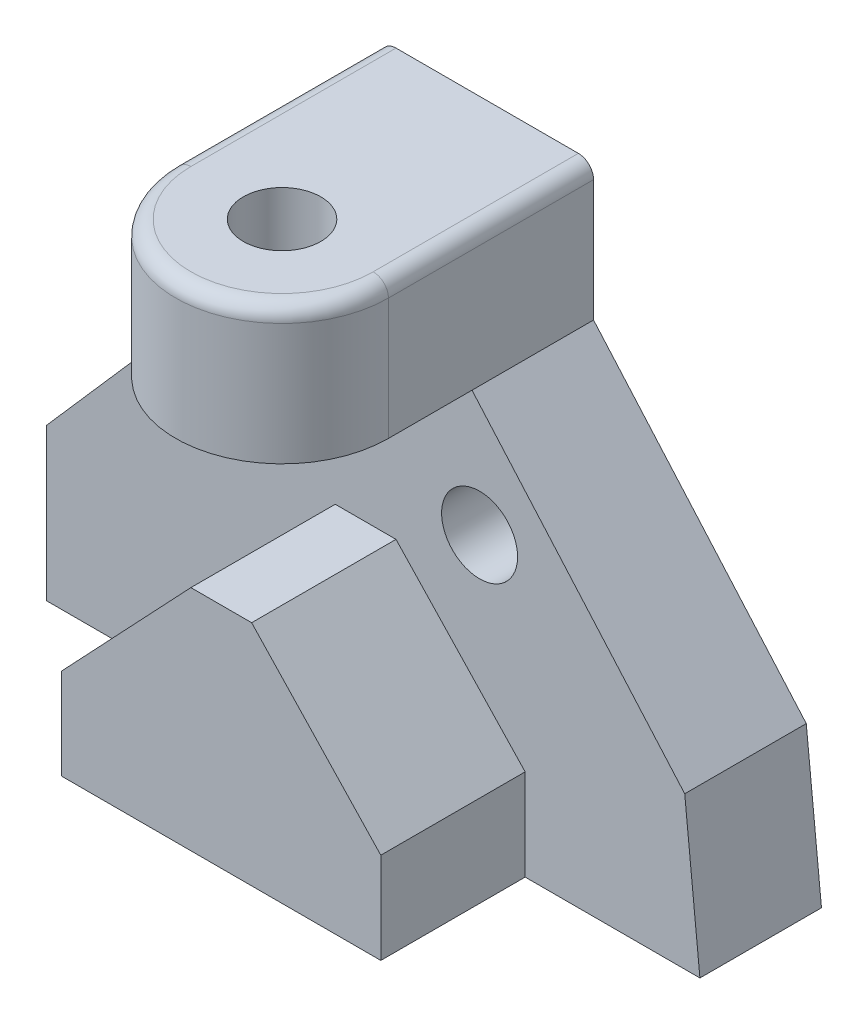
ISO-10303-21;
HEADER;
FILE_DESCRIPTION(('STEP AP214'),'2;1');
FILE_NAME('part.step','',(''),(''),'','','');
FILE_SCHEMA(('AUTOMOTIVE_DESIGN { 1 0 10303 214 1 1 1 1 }'));
ENDSEC;
DATA;
#1=APPLICATION_CONTEXT('core data for automotive mechanical design processes');
#2=APPLICATION_PROTOCOL_DEFINITION('international standard','automotive_design',2000,#1);
#3=PRODUCT_CONTEXT('',#1,'mechanical');
#4=PRODUCT('Part','Part','',(#3));
#5=PRODUCT_RELATED_PRODUCT_CATEGORY('part','',(#4));
#6=PRODUCT_DEFINITION_FORMATION('','',#4);
#7=PRODUCT_DEFINITION_CONTEXT('part definition',#1,'design');
#8=PRODUCT_DEFINITION('design','',#6,#7);
#9=PRODUCT_DEFINITION_SHAPE('','',#8);
#10=(LENGTH_UNIT() NAMED_UNIT(*) SI_UNIT(.MILLI.,.METRE.));
#11=(NAMED_UNIT(*) PLANE_ANGLE_UNIT() SI_UNIT($,.RADIAN.));
#12=(NAMED_UNIT(*) SI_UNIT($,.STERADIAN.) SOLID_ANGLE_UNIT());
#13=UNCERTAINTY_MEASURE_WITH_UNIT(LENGTH_MEASURE(1.E-05),#10,'distance_accuracy_value','');
#14=(GEOMETRIC_REPRESENTATION_CONTEXT(3) GLOBAL_UNCERTAINTY_ASSIGNED_CONTEXT((#13)) GLOBAL_UNIT_ASSIGNED_CONTEXT((#10,
#11,#12)) REPRESENTATION_CONTEXT('',''));
#15=CARTESIAN_POINT('',(0.,0.,0.));
#16=DIRECTION('',(0.,0.,1.));
#17=DIRECTION('',(1.,0.,0.));
#18=AXIS2_PLACEMENT_3D('',#15,#16,#17);
#19=CARTESIAN_POINT('',(0.,0.,16.));
#20=DIRECTION('',(0.,0.,1.));
#21=DIRECTION('',(1.,0.,0.));
#22=AXIS2_PLACEMENT_3D('',#19,#20,#21);
#23=PLANE('',#22);
#24=CARTESIAN_POINT('',(-15.,16.,16.));
#25=DIRECTION('',(0.,0.,1.));
#26=DIRECTION('',(1.,0.,0.));
#27=AXIS2_PLACEMENT_3D('',#24,#25,#26);
#28=CIRCLE('',#27,4.99999999999999);
#29=CARTESIAN_POINT('',(-10.,16.,16.));
#30=VERTEX_POINT('',#29);
#31=EDGE_CURVE('E317',#30,#30,#28,.T.);
#32=ORIENTED_EDGE('',*,*,#31,.F.);
#33=EDGE_LOOP('',(#32));
#34=FACE_BOUND('',#33,.T.);
#35=CARTESIAN_POINT('',(15.,16.,16.));
#36=DIRECTION('',(0.,0.,1.));
#37=DIRECTION('',(1.,0.,0.));
#38=AXIS2_PLACEMENT_3D('',#35,#36,#37);
#39=CIRCLE('',#38,4.99999999999999);
#40=CARTESIAN_POINT('',(20.,16.,16.));
#41=VERTEX_POINT('',#40);
#42=EDGE_CURVE('E309',#41,#41,#39,.T.);
#43=ORIENTED_EDGE('',*,*,#42,.F.);
#44=EDGE_LOOP('',(#43));
#45=FACE_BOUND('',#44,.T.);
#46=DIRECTION('',(0.686623532963717,-0.727013152549817,0.));
#47=VECTOR('',#46,1.);
#48=CARTESIAN_POINT('',(4.,9.99999999999999,16.));
#49=LINE('',#48,#47);
#50=CARTESIAN_POINT('',(4.,9.99999999999999,16.));
#51=VERTEX_POINT('',#50);
#52=CARTESIAN_POINT('',(21.,-8.,16.));
#53=VERTEX_POINT('',#52);
#54=EDGE_CURVE('E198',#51,#53,#49,.T.);
#55=ORIENTED_EDGE('',*,*,#54,.T.);
#56=DIRECTION('',(0.,-1.,0.));
#57=VECTOR('',#56,1.);
#58=CARTESIAN_POINT('',(21.,-8.,16.));
#59=LINE('',#58,#57);
#60=CARTESIAN_POINT('',(21.,-20.,16.));
#61=VERTEX_POINT('',#60);
#62=EDGE_CURVE('E219',#53,#61,#59,.T.);
#63=ORIENTED_EDGE('',*,*,#62,.T.);
#64=DIRECTION('',(1.,0.,0.));
#65=VECTOR('',#64,1.);
#66=CARTESIAN_POINT('',(-42.,-20.,16.));
#67=LINE('',#66,#65);
#68=CARTESIAN_POINT('',(44.,-20.,16.));
#69=VERTEX_POINT('',#68);
#70=EDGE_CURVE('E246',#61,#69,#67,.T.);
#71=ORIENTED_EDGE('',*,*,#70,.T.);
#72=DIRECTION('',(-0.0995037190209993,0.995037190209989,0.));
#73=VECTOR('',#72,1.);
#74=CARTESIAN_POINT('',(42.,0.,16.));
#75=LINE('',#74,#73);
#76=CARTESIAN_POINT('',(42.,0.,16.));
#77=VERTEX_POINT('',#76);
#78=EDGE_CURVE('E249',#69,#77,#75,.T.);
#79=ORIENTED_EDGE('',*,*,#78,.T.);
#80=DIRECTION('',(-0.658504607868518,0.752576694706878,0.));
#81=VECTOR('',#80,1.);
#82=CARTESIAN_POINT('',(14.,32.,16.));
#83=LINE('',#82,#81);
#84=CARTESIAN_POINT('',(14.,32.,16.));
#85=VERTEX_POINT('',#84);
#86=EDGE_CURVE('E251',#77,#85,#83,.T.);
#87=ORIENTED_EDGE('',*,*,#86,.T.);
#88=DIRECTION('',(-1.,0.,0.));
#89=VECTOR('',#88,1.);
#90=CARTESIAN_POINT('',(14.,32.,16.));
#91=LINE('',#90,#89);
#92=CARTESIAN_POINT('',(-14.,32.,16.));
#93=VERTEX_POINT('',#92);
#94=EDGE_CURVE('E254',#85,#93,#91,.T.);
#95=ORIENTED_EDGE('',*,*,#94,.T.);
#96=DIRECTION('',(-0.658504607868518,-0.752576694706878,0.));
#97=VECTOR('',#96,1.);
#98=CARTESIAN_POINT('',(-14.,32.,16.));
#99=LINE('',#98,#97);
#100=CARTESIAN_POINT('',(-42.,0.,16.));
#101=VERTEX_POINT('',#100);
#102=EDGE_CURVE('E240',#93,#101,#99,.T.);
#103=ORIENTED_EDGE('',*,*,#102,.T.);
#104=DIRECTION('',(0.,-1.,0.));
#105=VECTOR('',#104,1.);
#106=CARTESIAN_POINT('',(-42.,0.,16.));
#107=LINE('',#106,#105);
#108=CARTESIAN_POINT('',(-42.,-20.,16.));
#109=VERTEX_POINT('',#108);
#110=EDGE_CURVE('E243',#101,#109,#107,.T.);
#111=ORIENTED_EDGE('',*,*,#110,.T.);
#112=CARTESIAN_POINT('',(-21.,-20.,16.));
#113=VERTEX_POINT('',#112);
#114=EDGE_CURVE('E247',#109,#113,#67,.T.);
#115=ORIENTED_EDGE('',*,*,#114,.T.);
#116=DIRECTION('',(0.,-1.,0.));
#117=VECTOR('',#116,1.);
#118=CARTESIAN_POINT('',(-21.,-8.,16.));
#119=LINE('',#118,#117);
#120=CARTESIAN_POINT('',(-21.,-8.,16.));
#121=VERTEX_POINT('',#120);
#122=EDGE_CURVE('E216',#121,#113,#119,.T.);
#123=ORIENTED_EDGE('',*,*,#122,.F.);
#124=DIRECTION('',(-0.686623532963716,-0.727013152549817,0.));
#125=VECTOR('',#124,1.);
#126=CARTESIAN_POINT('',(-4.,10.,16.));
#127=LINE('',#126,#125);
#128=CARTESIAN_POINT('',(-4.,10.,16.));
#129=VERTEX_POINT('',#128);
#130=EDGE_CURVE('E213',#129,#121,#127,.T.);
#131=ORIENTED_EDGE('',*,*,#130,.F.);
#132=DIRECTION('',(-1.,0.,0.));
#133=VECTOR('',#132,1.);
#134=CARTESIAN_POINT('',(4.,9.99999999999999,16.));
#135=LINE('',#134,#133);
#136=EDGE_CURVE('E165',#51,#129,#135,.T.);
#137=ORIENTED_EDGE('',*,*,#136,.F.);
#138=EDGE_LOOP('',(#55,#63,#71,#79,#87,#95,#103,#111,#115,#123,#131,#137));
#139=FACE_BOUND('',#138,.T.);
#140=ADVANCED_FACE('F40',(#34,#45,#139),#23,.T.);
#141=CARTESIAN_POINT('',(-14.,32.,16.));
#142=DIRECTION('',(0.752576694706878,-0.658504607868518,0.));
#143=DIRECTION('',(0.658504607868518,0.752576694706878,0.));
#144=AXIS2_PLACEMENT_3D('',#141,#142,#143);
#145=PLANE('',#144);
#146=DIRECTION('',(-0.658504607868518,-0.752576694706878,0.));
#147=VECTOR('',#146,1.);
#148=CARTESIAN_POINT('',(-14.,32.,0.));
#149=LINE('',#148,#147);
#150=CARTESIAN_POINT('',(-14.,32.,0.));
#151=VERTEX_POINT('',#150);
#152=CARTESIAN_POINT('',(-42.,0.,0.));
#153=VERTEX_POINT('',#152);
#154=EDGE_CURVE('E239',#151,#153,#149,.T.);
#155=ORIENTED_EDGE('',*,*,#154,.T.);
#156=DIRECTION('',(0.,0.,-1.));
#157=VECTOR('',#156,1.);
#158=CARTESIAN_POINT('',(-42.,0.,16.));
#159=LINE('',#158,#157);
#160=EDGE_CURVE('E279',#101,#153,#159,.T.);
#161=ORIENTED_EDGE('',*,*,#160,.F.);
#162=ORIENTED_EDGE('',*,*,#102,.F.);
#163=DIRECTION('',(0.,0.,-1.));
#164=VECTOR('',#163,1.);
#165=CARTESIAN_POINT('',(-14.,32.,16.));
#166=LINE('',#165,#164);
#167=EDGE_CURVE('E172',#93,#151,#166,.T.);
#168=ORIENTED_EDGE('',*,*,#167,.T.);
#169=EDGE_LOOP('',(#155,#161,#162,#168));
#170=FACE_BOUND('',#169,.T.);
#171=ADVANCED_FACE('F325',(#170),#145,.F.);
#172=CARTESIAN_POINT('',(-42.,0.,16.));
#173=DIRECTION('',(1.,0.,0.));
#174=DIRECTION('',(0.,1.,0.));
#175=AXIS2_PLACEMENT_3D('',#172,#173,#174);
#176=PLANE('',#175);
#177=DIRECTION('',(0.,-1.,0.));
#178=VECTOR('',#177,1.);
#179=CARTESIAN_POINT('',(-42.,0.,0.));
#180=LINE('',#179,#178);
#181=CARTESIAN_POINT('',(-42.,-20.,0.));
#182=VERTEX_POINT('',#181);
#183=EDGE_CURVE('E258',#153,#182,#180,.T.);
#184=ORIENTED_EDGE('',*,*,#183,.T.);
#185=DIRECTION('',(0.,0.,-1.));
#186=VECTOR('',#185,1.);
#187=CARTESIAN_POINT('',(-42.,-20.,16.));
#188=LINE('',#187,#186);
#189=EDGE_CURVE('E276',#109,#182,#188,.T.);
#190=ORIENTED_EDGE('',*,*,#189,.F.);
#191=ORIENTED_EDGE('',*,*,#110,.F.);
#192=ORIENTED_EDGE('',*,*,#160,.T.);
#193=EDGE_LOOP('',(#184,#190,#191,#192));
#194=FACE_BOUND('',#193,.T.);
#195=ADVANCED_FACE('F373',(#194),#176,.F.);
#196=CARTESIAN_POINT('',(-42.,-20.,16.));
#197=DIRECTION('',(0.,1.,0.));
#198=DIRECTION('',(0.,0.,1.));
#199=AXIS2_PLACEMENT_3D('',#196,#197,#198);
#200=PLANE('',#199);
#201=DIRECTION('',(1.,0.,0.));
#202=VECTOR('',#201,1.);
#203=CARTESIAN_POINT('',(-42.,-20.,0.));
#204=LINE('',#203,#202);
#205=CARTESIAN_POINT('',(44.,-20.,0.));
#206=VERTEX_POINT('',#205);
#207=EDGE_CURVE('E260',#182,#206,#204,.T.);
#208=ORIENTED_EDGE('',*,*,#207,.T.);
#209=DIRECTION('',(0.,0.,-1.));
#210=VECTOR('',#209,1.);
#211=CARTESIAN_POINT('',(44.,-20.,16.));
#212=LINE('',#211,#210);
#213=EDGE_CURVE('E273',#69,#206,#212,.T.);
#214=ORIENTED_EDGE('',*,*,#213,.F.);
#215=ORIENTED_EDGE('',*,*,#70,.F.);
#216=DIRECTION('',(0.,0.,-1.));
#217=VECTOR('',#216,1.);
#218=CARTESIAN_POINT('',(21.,-20.,35.));
#219=LINE('',#218,#217);
#220=CARTESIAN_POINT('',(21.,-20.,35.));
#221=VERTEX_POINT('',#220);
#222=EDGE_CURVE('E227',#221,#61,#219,.T.);
#223=ORIENTED_EDGE('',*,*,#222,.F.);
#224=DIRECTION('',(1.,0.,0.));
#225=VECTOR('',#224,1.);
#226=CARTESIAN_POINT('',(-21.,-20.,35.));
#227=LINE('',#226,#225);
#228=CARTESIAN_POINT('',(-21.,-20.,35.));
#229=VERTEX_POINT('',#228);
#230=EDGE_CURVE('E202',#229,#221,#227,.T.);
#231=ORIENTED_EDGE('',*,*,#230,.F.);
#232=DIRECTION('',(0.,0.,-1.));
#233=VECTOR('',#232,1.);
#234=CARTESIAN_POINT('',(-21.,-20.,35.));
#235=LINE('',#234,#233);
#236=EDGE_CURVE('E230',#229,#113,#235,.T.);
#237=ORIENTED_EDGE('',*,*,#236,.T.);
#238=ORIENTED_EDGE('',*,*,#114,.F.);
#239=ORIENTED_EDGE('',*,*,#189,.T.);
#240=EDGE_LOOP('',(#208,#214,#215,#223,#231,#237,#238,#239));
#241=FACE_BOUND('',#240,.T.);
#242=ADVANCED_FACE('F341',(#241),#200,.F.);
#243=CARTESIAN_POINT('',(42.,0.,16.));
#244=DIRECTION('',(-0.995037190209989,-0.0995037190209993,0.));
#245=DIRECTION('',(0.0995037190209993,-0.995037190209989,0.));
#246=AXIS2_PLACEMENT_3D('',#243,#244,#245);
#247=PLANE('',#246);
#248=DIRECTION('',(-0.0995037190209993,0.995037190209989,0.));
#249=VECTOR('',#248,1.);
#250=CARTESIAN_POINT('',(42.,0.,0.));
#251=LINE('',#250,#249);
#252=CARTESIAN_POINT('',(42.,0.,0.));
#253=VERTEX_POINT('',#252);
#254=EDGE_CURVE('E262',#206,#253,#251,.T.);
#255=ORIENTED_EDGE('',*,*,#254,.T.);
#256=DIRECTION('',(0.,0.,-1.));
#257=VECTOR('',#256,1.);
#258=CARTESIAN_POINT('',(42.,0.,16.));
#259=LINE('',#258,#257);
#260=EDGE_CURVE('E270',#77,#253,#259,.T.);
#261=ORIENTED_EDGE('',*,*,#260,.F.);
#262=ORIENTED_EDGE('',*,*,#78,.F.);
#263=ORIENTED_EDGE('',*,*,#213,.T.);
#264=EDGE_LOOP('',(#255,#261,#262,#263));
#265=FACE_BOUND('',#264,.T.);
#266=ADVANCED_FACE('F348',(#265),#247,.F.);
#267=CARTESIAN_POINT('',(14.,32.,16.));
#268=DIRECTION('',(-0.752576694706878,-0.658504607868518,0.));
#269=DIRECTION('',(0.658504607868518,-0.752576694706878,0.));
#270=AXIS2_PLACEMENT_3D('',#267,#268,#269);
#271=PLANE('',#270);
#272=DIRECTION('',(-0.658504607868518,0.752576694706878,0.));
#273=VECTOR('',#272,1.);
#274=CARTESIAN_POINT('',(14.,32.,0.));
#275=LINE('',#274,#273);
#276=CARTESIAN_POINT('',(14.,32.,0.));
#277=VERTEX_POINT('',#276);
#278=EDGE_CURVE('E244',#253,#277,#275,.T.);
#279=ORIENTED_EDGE('',*,*,#278,.T.);
#280=DIRECTION('',(0.,0.,-1.));
#281=VECTOR('',#280,1.);
#282=CARTESIAN_POINT('',(14.,32.,16.));
#283=LINE('',#282,#281);
#284=EDGE_CURVE('E267',#85,#277,#283,.T.);
#285=ORIENTED_EDGE('',*,*,#284,.F.);
#286=ORIENTED_EDGE('',*,*,#86,.F.);
#287=ORIENTED_EDGE('',*,*,#260,.T.);
#288=EDGE_LOOP('',(#279,#285,#286,#287));
#289=FACE_BOUND('',#288,.T.);
#290=ADVANCED_FACE('F352',(#289),#271,.F.);
#291=CARTESIAN_POINT('',(0.,0.,0.));
#292=DIRECTION('',(0.,0.,1.));
#293=DIRECTION('',(1.,0.,0.));
#294=AXIS2_PLACEMENT_3D('',#291,#292,#293);
#295=PLANE('',#294);
#296=CARTESIAN_POINT('',(-15.,16.,0.));
#297=DIRECTION('',(0.,0.,1.));
#298=DIRECTION('',(1.,0.,0.));
#299=AXIS2_PLACEMENT_3D('',#296,#297,#298);
#300=CIRCLE('',#299,5.);
#301=CARTESIAN_POINT('',(-10.,16.,0.));
#302=VERTEX_POINT('',#301);
#303=EDGE_CURVE('E314',#302,#302,#300,.T.);
#304=ORIENTED_EDGE('',*,*,#303,.T.);
#305=EDGE_LOOP('',(#304));
#306=FACE_BOUND('',#305,.T.);
#307=CARTESIAN_POINT('',(15.,16.,0.));
#308=DIRECTION('',(0.,0.,1.));
#309=DIRECTION('',(1.,0.,0.));
#310=AXIS2_PLACEMENT_3D('',#307,#308,#309);
#311=CIRCLE('',#310,5.);
#312=CARTESIAN_POINT('',(20.,16.,0.));
#313=VERTEX_POINT('',#312);
#314=EDGE_CURVE('E305',#313,#313,#311,.T.);
#315=ORIENTED_EDGE('',*,*,#314,.T.);
#316=EDGE_LOOP('',(#315));
#317=FACE_BOUND('',#316,.T.);
#318=DIRECTION('',(1.,0.,0.));
#319=VECTOR('',#318,1.);
#320=CARTESIAN_POINT('',(-14.,50.,0.));
#321=LINE('',#320,#319);
#322=CARTESIAN_POINT('',(-12.,50.,0.));
#323=VERTEX_POINT('',#322);
#324=CARTESIAN_POINT('',(12.,50.,0.));
#325=VERTEX_POINT('',#324);
#326=EDGE_CURVE('E175',#323,#325,#321,.T.);
#327=ORIENTED_EDGE('',*,*,#326,.T.);
#328=CARTESIAN_POINT('',(12.,48.,0.));
#329=DIRECTION('',(0.,0.,1.));
#330=DIRECTION('',(1.,0.,0.));
#331=AXIS2_PLACEMENT_3D('',#328,#329,#330);
#332=CIRCLE('',#331,2.);
#333=CARTESIAN_POINT('',(14.,48.,0.));
#334=VERTEX_POINT('',#333);
#335=EDGE_CURVE('E291',#325,#334,#332,.F.);
#336=ORIENTED_EDGE('',*,*,#335,.T.);
#337=DIRECTION('',(0.,-1.,0.));
#338=VECTOR('',#337,1.);
#339=CARTESIAN_POINT('',(14.,50.,0.));
#340=LINE('',#339,#338);
#341=EDGE_CURVE('E181',#334,#277,#340,.T.);
#342=ORIENTED_EDGE('',*,*,#341,.T.);
#343=ORIENTED_EDGE('',*,*,#278,.F.);
#344=ORIENTED_EDGE('',*,*,#254,.F.);
#345=ORIENTED_EDGE('',*,*,#207,.F.);
#346=ORIENTED_EDGE('',*,*,#183,.F.);
#347=ORIENTED_EDGE('',*,*,#154,.F.);
#348=DIRECTION('',(0.,-1.,0.));
#349=VECTOR('',#348,1.);
#350=CARTESIAN_POINT('',(-14.,50.,0.));
#351=LINE('',#350,#349);
#352=CARTESIAN_POINT('',(-14.,48.,0.));
#353=VERTEX_POINT('',#352);
#354=EDGE_CURVE('E184',#353,#151,#351,.T.);
#355=ORIENTED_EDGE('',*,*,#354,.F.);
#356=CARTESIAN_POINT('',(-12.,48.,0.));
#357=DIRECTION('',(0.,0.,1.));
#358=DIRECTION('',(1.,0.,0.));
#359=AXIS2_PLACEMENT_3D('',#356,#357,#358);
#360=CIRCLE('',#359,2.);
#361=EDGE_CURVE('E289',#353,#323,#360,.F.);
#362=ORIENTED_EDGE('',*,*,#361,.T.);
#363=EDGE_LOOP('',(#327,#336,#342,#343,#344,#345,#346,#347,#355,#362));
#364=FACE_BOUND('',#363,.T.);
#365=ADVANCED_FACE('F364',(#306,#317,#364),#295,.F.);
#366=CARTESIAN_POINT('',(4.,9.99999999999999,35.));
#367=DIRECTION('',(0.,-1.,0.));
#368=DIRECTION('',(1.,0.,0.));
#369=AXIS2_PLACEMENT_3D('',#366,#367,#368);
#370=PLANE('',#369);
#371=ORIENTED_EDGE('',*,*,#136,.T.);
#372=DIRECTION('',(0.,0.,-1.));
#373=VECTOR('',#372,1.);
#374=CARTESIAN_POINT('',(-4.,10.,35.));
#375=LINE('',#374,#373);
#376=CARTESIAN_POINT('',(-4.,10.,35.));
#377=VERTEX_POINT('',#376);
#378=EDGE_CURVE('E236',#377,#129,#375,.T.);
#379=ORIENTED_EDGE('',*,*,#378,.F.);
#380=DIRECTION('',(-1.,0.,0.));
#381=VECTOR('',#380,1.);
#382=CARTESIAN_POINT('',(4.,9.99999999999999,35.));
#383=LINE('',#382,#381);
#384=CARTESIAN_POINT('',(4.,9.99999999999999,35.));
#385=VERTEX_POINT('',#384);
#386=EDGE_CURVE('E194',#385,#377,#383,.T.);
#387=ORIENTED_EDGE('',*,*,#386,.F.);
#388=DIRECTION('',(0.,0.,-1.));
#389=VECTOR('',#388,1.);
#390=CARTESIAN_POINT('',(4.,9.99999999999999,35.));
#391=LINE('',#390,#389);
#392=EDGE_CURVE('E210',#385,#51,#391,.T.);
#393=ORIENTED_EDGE('',*,*,#392,.T.);
#394=EDGE_LOOP('',(#371,#379,#387,#393));
#395=FACE_BOUND('',#394,.T.);
#396=ADVANCED_FACE('F384',(#395),#370,.F.);
#397=CARTESIAN_POINT('',(-4.,10.,35.));
#398=DIRECTION('',(0.727013152549818,-0.686623532963716,0.));
#399=DIRECTION('',(0.686623532963716,0.727013152549818,0.));
#400=AXIS2_PLACEMENT_3D('',#397,#398,#399);
#401=PLANE('',#400);
#402=ORIENTED_EDGE('',*,*,#130,.T.);
#403=DIRECTION('',(0.,0.,-1.));
#404=VECTOR('',#403,1.);
#405=CARTESIAN_POINT('',(-21.,-8.,35.));
#406=LINE('',#405,#404);
#407=CARTESIAN_POINT('',(-21.,-8.,35.));
#408=VERTEX_POINT('',#407);
#409=EDGE_CURVE('E233',#408,#121,#406,.T.);
#410=ORIENTED_EDGE('',*,*,#409,.F.);
#411=DIRECTION('',(-0.686623532963716,-0.727013152549817,0.));
#412=VECTOR('',#411,1.);
#413=CARTESIAN_POINT('',(-4.,10.,35.));
#414=LINE('',#413,#412);
#415=EDGE_CURVE('E197',#377,#408,#414,.T.);
#416=ORIENTED_EDGE('',*,*,#415,.F.);
#417=ORIENTED_EDGE('',*,*,#378,.T.);
#418=EDGE_LOOP('',(#402,#410,#416,#417));
#419=FACE_BOUND('',#418,.T.);
#420=ADVANCED_FACE('F380',(#419),#401,.F.);
#421=CARTESIAN_POINT('',(-21.,-8.,35.));
#422=DIRECTION('',(1.,0.,0.));
#423=DIRECTION('',(0.,0.,-1.));
#424=AXIS2_PLACEMENT_3D('',#421,#422,#423);
#425=PLANE('',#424);
#426=ORIENTED_EDGE('',*,*,#122,.T.);
#427=ORIENTED_EDGE('',*,*,#236,.F.);
#428=DIRECTION('',(0.,-1.,0.));
#429=VECTOR('',#428,1.);
#430=CARTESIAN_POINT('',(-21.,-8.,35.));
#431=LINE('',#430,#429);
#432=EDGE_CURVE('E200',#408,#229,#431,.T.);
#433=ORIENTED_EDGE('',*,*,#432,.F.);
#434=ORIENTED_EDGE('',*,*,#409,.T.);
#435=EDGE_LOOP('',(#426,#427,#433,#434));
#436=FACE_BOUND('',#435,.T.);
#437=ADVANCED_FACE('F377',(#436),#425,.F.);
#438=CARTESIAN_POINT('',(21.,-8.,35.));
#439=DIRECTION('',(1.,0.,0.));
#440=DIRECTION('',(0.,0.,-1.));
#441=AXIS2_PLACEMENT_3D('',#438,#439,#440);
#442=PLANE('',#441);
#443=ORIENTED_EDGE('',*,*,#62,.F.);
#444=DIRECTION('',(0.,0.,-1.));
#445=VECTOR('',#444,1.);
#446=CARTESIAN_POINT('',(21.,-8.,35.));
#447=LINE('',#446,#445);
#448=CARTESIAN_POINT('',(21.,-8.,35.));
#449=VERTEX_POINT('',#448);
#450=EDGE_CURVE('E224',#449,#53,#447,.T.);
#451=ORIENTED_EDGE('',*,*,#450,.F.);
#452=DIRECTION('',(0.,-1.,0.));
#453=VECTOR('',#452,1.);
#454=CARTESIAN_POINT('',(21.,-8.,35.));
#455=LINE('',#454,#453);
#456=EDGE_CURVE('E204',#449,#221,#455,.T.);
#457=ORIENTED_EDGE('',*,*,#456,.T.);
#458=ORIENTED_EDGE('',*,*,#222,.T.);
#459=EDGE_LOOP('',(#443,#451,#457,#458));
#460=FACE_BOUND('',#459,.T.);
#461=ADVANCED_FACE('F337',(#460),#442,.T.);
#462=CARTESIAN_POINT('',(4.,9.99999999999999,35.));
#463=DIRECTION('',(0.727013152549817,0.686623532963717,0.));
#464=DIRECTION('',(-0.686623532963717,0.727013152549817,0.));
#465=AXIS2_PLACEMENT_3D('',#462,#463,#464);
#466=PLANE('',#465);
#467=ORIENTED_EDGE('',*,*,#54,.F.);
#468=ORIENTED_EDGE('',*,*,#392,.F.);
#469=DIRECTION('',(0.686623532963717,-0.727013152549817,0.));
#470=VECTOR('',#469,1.);
#471=CARTESIAN_POINT('',(4.,9.99999999999999,35.));
#472=LINE('',#471,#470);
#473=EDGE_CURVE('E207',#385,#449,#472,.T.);
#474=ORIENTED_EDGE('',*,*,#473,.T.);
#475=ORIENTED_EDGE('',*,*,#450,.T.);
#476=EDGE_LOOP('',(#467,#468,#474,#475));
#477=FACE_BOUND('',#476,.T.);
#478=ADVANCED_FACE('F333',(#477),#466,.T.);
#479=CARTESIAN_POINT('',(0.,0.,35.));
#480=DIRECTION('',(0.,0.,1.));
#481=DIRECTION('',(1.,0.,0.));
#482=AXIS2_PLACEMENT_3D('',#479,#480,#481);
#483=PLANE('',#482);
#484=ORIENTED_EDGE('',*,*,#386,.T.);
#485=ORIENTED_EDGE('',*,*,#415,.T.);
#486=ORIENTED_EDGE('',*,*,#432,.T.);
#487=ORIENTED_EDGE('',*,*,#230,.T.);
#488=ORIENTED_EDGE('',*,*,#456,.F.);
#489=ORIENTED_EDGE('',*,*,#473,.F.);
#490=EDGE_LOOP('',(#484,#485,#486,#487,#488,#489));
#491=FACE_BOUND('',#490,.T.);
#492=ADVANCED_FACE('F386',(#491),#483,.T.);
#493=CARTESIAN_POINT('',(0.,50.,27.));
#494=DIRECTION('',(0.,-1.,0.));
#495=DIRECTION('',(0.,0.,-1.));
#496=AXIS2_PLACEMENT_3D('',#493,#494,#495);
#497=CYLINDRICAL_SURFACE('',#496,14.);
#498=DIRECTION('',(0.,-1.,0.));
#499=VECTOR('',#498,1.);
#500=CARTESIAN_POINT('',(14.,50.,27.));
#501=LINE('',#500,#499);
#502=CARTESIAN_POINT('',(14.,48.,27.));
#503=VERTEX_POINT('',#502);
#504=CARTESIAN_POINT('',(14.,32.,27.));
#505=VERTEX_POINT('',#504);
#506=EDGE_CURVE('E166',#503,#505,#501,.T.);
#507=ORIENTED_EDGE('',*,*,#506,.F.);
#508=CARTESIAN_POINT('',(0.,48.,27.));
#509=DIRECTION('',(0.,1.,0.));
#510=DIRECTION('',(0.,0.,1.));
#511=AXIS2_PLACEMENT_3D('',#508,#509,#510);
#512=CIRCLE('',#511,14.);
#513=CARTESIAN_POINT('',(-14.,48.,27.));
#514=VERTEX_POINT('',#513);
#515=EDGE_CURVE('E49',#503,#514,#512,.F.);
#516=ORIENTED_EDGE('',*,*,#515,.T.);
#517=DIRECTION('',(0.,-1.,0.));
#518=VECTOR('',#517,1.);
#519=CARTESIAN_POINT('',(-14.,50.,27.));
#520=LINE('',#519,#518);
#521=CARTESIAN_POINT('',(-14.,32.,27.));
#522=VERTEX_POINT('',#521);
#523=EDGE_CURVE('E158',#514,#522,#520,.T.);
#524=ORIENTED_EDGE('',*,*,#523,.T.);
#525=CARTESIAN_POINT('',(0.,32.,27.));
#526=DIRECTION('',(0.,1.,0.));
#527=DIRECTION('',(0.,0.,1.));
#528=AXIS2_PLACEMENT_3D('',#525,#526,#527);
#529=CIRCLE('',#528,14.);
#530=EDGE_CURVE('E162',#522,#505,#529,.T.);
#531=ORIENTED_EDGE('',*,*,#530,.T.);
#532=EDGE_LOOP('',(#507,#516,#524,#531));
#533=FACE_BOUND('',#532,.T.);
#534=ADVANCED_FACE('F160',(#533),#497,.T.);
#535=CARTESIAN_POINT('',(0.,32.,0.));
#536=DIRECTION('',(0.,1.,0.));
#537=DIRECTION('',(0.,0.,1.));
#538=AXIS2_PLACEMENT_3D('',#535,#536,#537);
#539=PLANE('',#538);
#540=CARTESIAN_POINT('',(0.,32.,27.));
#541=DIRECTION('',(0.,1.,0.));
#542=DIRECTION('',(0.,0.,1.));
#543=AXIS2_PLACEMENT_3D('',#540,#541,#542);
#544=CIRCLE('',#543,5.1);
#545=CARTESIAN_POINT('',(0.,32.,32.1));
#546=VERTEX_POINT('',#545);
#547=EDGE_CURVE('E187',#546,#546,#544,.T.);
#548=ORIENTED_EDGE('',*,*,#547,.T.);
#549=EDGE_LOOP('',(#548));
#550=FACE_BOUND('',#549,.T.);
#551=ORIENTED_EDGE('',*,*,#94,.F.);
#552=DIRECTION('',(0.,0.,-1.));
#553=VECTOR('',#552,1.);
#554=CARTESIAN_POINT('',(14.,32.,27.));
#555=LINE('',#554,#553);
#556=EDGE_CURVE('E176',#505,#85,#555,.T.);
#557=ORIENTED_EDGE('',*,*,#556,.F.);
#558=ORIENTED_EDGE('',*,*,#530,.F.);
#559=DIRECTION('',(0.,0.,-1.));
#560=VECTOR('',#559,1.);
#561=CARTESIAN_POINT('',(-14.,32.,27.));
#562=LINE('',#561,#560);
#563=EDGE_CURVE('E169',#522,#93,#562,.T.);
#564=ORIENTED_EDGE('',*,*,#563,.T.);
#565=EDGE_LOOP('',(#551,#557,#558,#564));
#566=FACE_BOUND('',#565,.T.);
#567=ADVANCED_FACE('F179',(#550,#566),#539,.F.);
#568=CARTESIAN_POINT('',(0.,50.,0.));
#569=DIRECTION('',(0.,1.,0.));
#570=DIRECTION('',(0.,0.,1.));
#571=AXIS2_PLACEMENT_3D('',#568,#569,#570);
#572=PLANE('',#571);
#573=CARTESIAN_POINT('',(0.,50.,27.));
#574=DIRECTION('',(0.,1.,0.));
#575=DIRECTION('',(0.,0.,1.));
#576=AXIS2_PLACEMENT_3D('',#573,#574,#575);
#577=CIRCLE('',#576,5.1);
#578=CARTESIAN_POINT('',(0.,50.,32.1));
#579=VERTEX_POINT('',#578);
#580=EDGE_CURVE('E301',#579,#579,#577,.T.);
#581=ORIENTED_EDGE('',*,*,#580,.F.);
#582=EDGE_LOOP('',(#581));
#583=FACE_BOUND('',#582,.T.);
#584=CARTESIAN_POINT('',(0.,50.,27.));
#585=DIRECTION('',(0.,1.,0.));
#586=DIRECTION('',(0.,0.,1.));
#587=AXIS2_PLACEMENT_3D('',#584,#585,#586);
#588=CIRCLE('',#587,12.);
#589=CARTESIAN_POINT('',(-12.,50.,27.));
#590=VERTEX_POINT('',#589);
#591=CARTESIAN_POINT('',(12.,50.,27.));
#592=VERTEX_POINT('',#591);
#593=EDGE_CURVE('E284',#590,#592,#588,.T.);
#594=ORIENTED_EDGE('',*,*,#593,.T.);
#595=DIRECTION('',(0.,0.,-1.));
#596=VECTOR('',#595,1.);
#597=CARTESIAN_POINT('',(12.,50.,0.));
#598=LINE('',#597,#596);
#599=EDGE_CURVE('E286',#592,#325,#598,.T.);
#600=ORIENTED_EDGE('',*,*,#599,.T.);
#601=ORIENTED_EDGE('',*,*,#326,.F.);
#602=DIRECTION('',(0.,0.,-1.));
#603=VECTOR('',#602,1.);
#604=CARTESIAN_POINT('',(-12.,50.,0.));
#605=LINE('',#604,#603);
#606=EDGE_CURVE('E282',#323,#590,#605,.F.);
#607=ORIENTED_EDGE('',*,*,#606,.T.);
#608=EDGE_LOOP('',(#594,#600,#601,#607));
#609=FACE_BOUND('',#608,.T.);
#610=ADVANCED_FACE('F432',(#583,#609),#572,.T.);
#611=CARTESIAN_POINT('',(14.,50.,27.));
#612=DIRECTION('',(-1.,0.,0.));
#613=DIRECTION('',(0.,0.,1.));
#614=AXIS2_PLACEMENT_3D('',#611,#612,#613);
#615=PLANE('',#614);
#616=ORIENTED_EDGE('',*,*,#341,.F.);
#617=DIRECTION('',(0.,0.,-1.));
#618=VECTOR('',#617,1.);
#619=CARTESIAN_POINT('',(14.,48.,27.));
#620=LINE('',#619,#618);
#621=EDGE_CURVE('E64',#334,#503,#620,.F.);
#622=ORIENTED_EDGE('',*,*,#621,.T.);
#623=ORIENTED_EDGE('',*,*,#506,.T.);
#624=ORIENTED_EDGE('',*,*,#556,.T.);
#625=ORIENTED_EDGE('',*,*,#284,.T.);
#626=EDGE_LOOP('',(#616,#622,#623,#624,#625));
#627=FACE_BOUND('',#626,.T.);
#628=ADVANCED_FACE('F353',(#627),#615,.F.);
#629=CARTESIAN_POINT('',(-14.,50.,27.));
#630=DIRECTION('',(-1.,0.,0.));
#631=DIRECTION('',(0.,0.,1.));
#632=AXIS2_PLACEMENT_3D('',#629,#630,#631);
#633=PLANE('',#632);
#634=ORIENTED_EDGE('',*,*,#523,.F.);
#635=DIRECTION('',(0.,0.,-1.));
#636=VECTOR('',#635,1.);
#637=CARTESIAN_POINT('',(-14.,48.,27.));
#638=LINE('',#637,#636);
#639=EDGE_CURVE('E11',#514,#353,#638,.T.);
#640=ORIENTED_EDGE('',*,*,#639,.T.);
#641=ORIENTED_EDGE('',*,*,#354,.T.);
#642=ORIENTED_EDGE('',*,*,#167,.F.);
#643=ORIENTED_EDGE('',*,*,#563,.F.);
#644=EDGE_LOOP('',(#634,#640,#641,#642,#643));
#645=FACE_BOUND('',#644,.T.);
#646=ADVANCED_FACE('F170',(#645),#633,.T.);
#647=CARTESIAN_POINT('',(-12.,48.,27.));
#648=DIRECTION('',(0.,0.,-1.));
#649=DIRECTION('',(-1.,0.,0.));
#650=AXIS2_PLACEMENT_3D('',#647,#648,#649);
#651=CYLINDRICAL_SURFACE('',#650,2.);
#652=ORIENTED_EDGE('',*,*,#361,.F.);
#653=ORIENTED_EDGE('',*,*,#639,.F.);
#654=CARTESIAN_POINT('',(-12.,48.,27.));
#655=DIRECTION('',(0.,0.,1.));
#656=DIRECTION('',(1.,0.,0.));
#657=AXIS2_PLACEMENT_3D('',#654,#655,#656);
#658=CIRCLE('',#657,2.);
#659=EDGE_CURVE('E44',#590,#514,#658,.T.);
#660=ORIENTED_EDGE('',*,*,#659,.F.);
#661=ORIENTED_EDGE('',*,*,#606,.F.);
#662=EDGE_LOOP('',(#652,#653,#660,#661));
#663=FACE_BOUND('',#662,.T.);
#664=ADVANCED_FACE('F42',(#663),#651,.T.);
#665=CARTESIAN_POINT('',(0.,48.,27.));
#666=DIRECTION('',(0.,1.,0.));
#667=DIRECTION('',(0.,0.,1.));
#668=AXIS2_PLACEMENT_3D('',#665,#666,#667);
#669=TOROIDAL_SURFACE('',#668,12.,2.);
#670=ORIENTED_EDGE('',*,*,#659,.T.);
#671=ORIENTED_EDGE('',*,*,#515,.F.);
#672=CARTESIAN_POINT('',(12.,48.,27.));
#673=DIRECTION('',(0.,0.,-1.));
#674=DIRECTION('',(-1.,0.,0.));
#675=AXIS2_PLACEMENT_3D('',#672,#673,#674);
#676=CIRCLE('',#675,2.);
#677=EDGE_CURVE('E294',#592,#503,#676,.T.);
#678=ORIENTED_EDGE('',*,*,#677,.F.);
#679=ORIENTED_EDGE('',*,*,#593,.F.);
#680=EDGE_LOOP('',(#670,#671,#678,#679));
#681=FACE_BOUND('',#680,.T.);
#682=ADVANCED_FACE('F355',(#681),#669,.T.);
#683=CARTESIAN_POINT('',(12.,48.,0.));
#684=DIRECTION('',(0.,0.,1.));
#685=DIRECTION('',(1.,0.,0.));
#686=AXIS2_PLACEMENT_3D('',#683,#684,#685);
#687=CYLINDRICAL_SURFACE('',#686,2.);
#688=ORIENTED_EDGE('',*,*,#677,.T.);
#689=ORIENTED_EDGE('',*,*,#621,.F.);
#690=ORIENTED_EDGE('',*,*,#335,.F.);
#691=ORIENTED_EDGE('',*,*,#599,.F.);
#692=EDGE_LOOP('',(#688,#689,#690,#691));
#693=FACE_BOUND('',#692,.T.);
#694=ADVANCED_FACE('F419',(#693),#687,.T.);
#695=CARTESIAN_POINT('',(0.,50.,27.));
#696=DIRECTION('',(0.,1.,0.));
#697=DIRECTION('',(0.,0.,1.));
#698=AXIS2_PLACEMENT_3D('',#695,#696,#697);
#699=CYLINDRICAL_SURFACE('',#698,5.1);
#700=ORIENTED_EDGE('',*,*,#547,.F.);
#701=EDGE_LOOP('',(#700));
#702=FACE_BOUND('',#701,.T.);
#703=ORIENTED_EDGE('',*,*,#580,.T.);
#704=EDGE_LOOP('',(#703));
#705=FACE_BOUND('',#704,.T.);
#706=ADVANCED_FACE('F421',(#702,#705),#699,.F.);
#707=CARTESIAN_POINT('',(15.,16.,16.));
#708=DIRECTION('',(0.,0.,1.));
#709=DIRECTION('',(1.,0.,0.));
#710=AXIS2_PLACEMENT_3D('',#707,#708,#709);
#711=CYLINDRICAL_SURFACE('',#710,4.99999999999999);
#712=ORIENTED_EDGE('',*,*,#314,.F.);
#713=EDGE_LOOP('',(#712));
#714=FACE_BOUND('',#713,.T.);
#715=ORIENTED_EDGE('',*,*,#42,.T.);
#716=EDGE_LOOP('',(#715));
#717=FACE_BOUND('',#716,.T.);
#718=ADVANCED_FACE('F441',(#714,#717),#711,.F.);
#719=CARTESIAN_POINT('',(-15.,16.,16.));
#720=DIRECTION('',(0.,0.,1.));
#721=DIRECTION('',(1.,0.,0.));
#722=AXIS2_PLACEMENT_3D('',#719,#720,#721);
#723=CYLINDRICAL_SURFACE('',#722,4.99999999999999);
#724=ORIENTED_EDGE('',*,*,#303,.F.);
#725=EDGE_LOOP('',(#724));
#726=FACE_BOUND('',#725,.T.);
#727=ORIENTED_EDGE('',*,*,#31,.T.);
#728=EDGE_LOOP('',(#727));
#729=FACE_BOUND('',#728,.T.);
#730=ADVANCED_FACE('F321',(#726,#729),#723,.F.);
#731=CLOSED_SHELL('',(#140,#171,#195,#242,#266,#290,#365,#396,#420,#437,#461,#478,#492,#534,
#567,#610,#628,#646,#664,#682,#694,#706,#718,#730));
#732=MANIFOLD_SOLID_BREP('B2',#731);
#733=ADVANCED_BREP_SHAPE_REPRESENTATION('',(#18,#732),#14);
#734=SHAPE_DEFINITION_REPRESENTATION(#9,#733);
ENDSEC;
END-ISO-10303-21;
